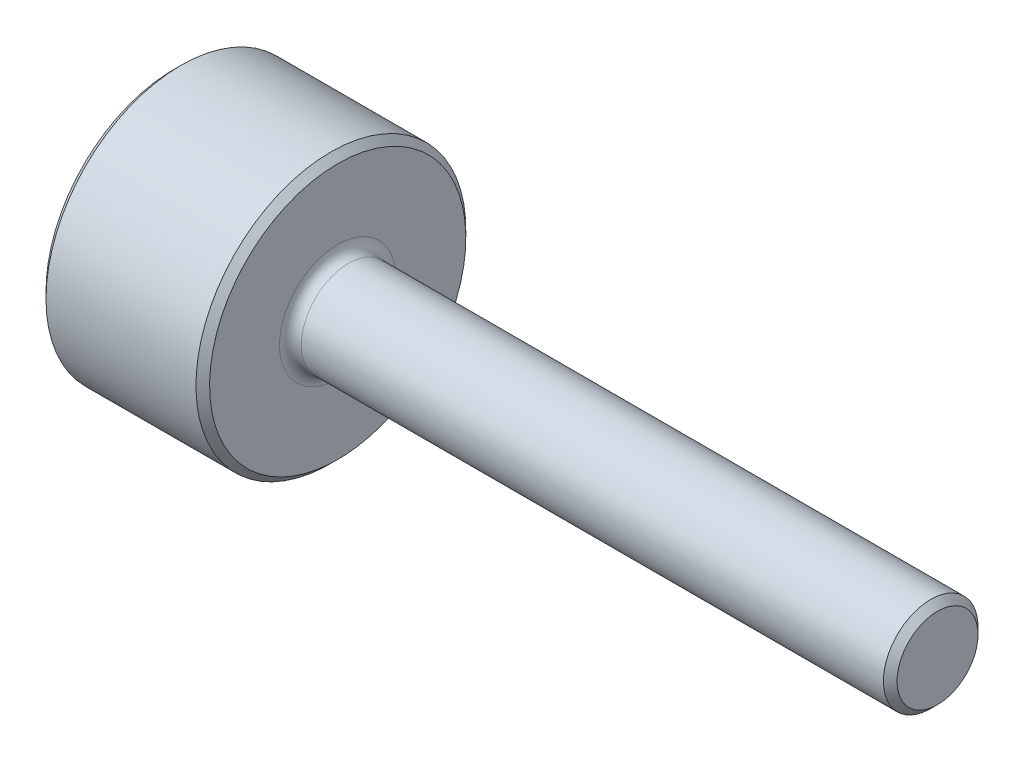
ISO-10303-21;
HEADER;
FILE_DESCRIPTION(('STEP AP214'),'2;1');
FILE_NAME('part.step','',(''),(''),'','','');
FILE_SCHEMA(('AUTOMOTIVE_DESIGN { 1 0 10303 214 1 1 1 1 }'));
ENDSEC;
DATA;
#1=APPLICATION_CONTEXT('core data for automotive mechanical design processes');
#2=APPLICATION_PROTOCOL_DEFINITION('international standard','automotive_design',2000,#1);
#3=PRODUCT_CONTEXT('',#1,'mechanical');
#4=PRODUCT('Part','Part','',(#3));
#5=PRODUCT_RELATED_PRODUCT_CATEGORY('part','',(#4));
#6=PRODUCT_DEFINITION_FORMATION('','',#4);
#7=PRODUCT_DEFINITION_CONTEXT('part definition',#1,'design');
#8=PRODUCT_DEFINITION('design','',#6,#7);
#9=PRODUCT_DEFINITION_SHAPE('','',#8);
#10=(LENGTH_UNIT() NAMED_UNIT(*) SI_UNIT(.MILLI.,.METRE.));
#11=(NAMED_UNIT(*) PLANE_ANGLE_UNIT() SI_UNIT($,.RADIAN.));
#12=(NAMED_UNIT(*) SI_UNIT($,.STERADIAN.) SOLID_ANGLE_UNIT());
#13=UNCERTAINTY_MEASURE_WITH_UNIT(LENGTH_MEASURE(1.E-05),#10,'distance_accuracy_value','');
#14=(GEOMETRIC_REPRESENTATION_CONTEXT(3) GLOBAL_UNCERTAINTY_ASSIGNED_CONTEXT((#13)) GLOBAL_UNIT_ASSIGNED_CONTEXT((#10,
#11,#12)) REPRESENTATION_CONTEXT('',''));
#15=CARTESIAN_POINT('',(0.,0.,0.));
#16=DIRECTION('',(0.,0.,1.));
#17=DIRECTION('',(1.,0.,0.));
#18=AXIS2_PLACEMENT_3D('',#15,#16,#17);
#19=CARTESIAN_POINT('',(-28.,4.94999999999999,0.));
#20=DIRECTION('',(-1.,0.,0.));
#21=DIRECTION('',(0.,-1.,0.));
#22=AXIS2_PLACEMENT_3D('',#19,#20,#21);
#23=PLANE('',#22);
#24=CARTESIAN_POINT('',(-28.,0.,0.));
#25=DIRECTION('',(-1.,0.,0.));
#26=DIRECTION('',(0.,-1.,0.));
#27=AXIS2_PLACEMENT_3D('',#24,#25,#26);
#28=CIRCLE('',#27,4.70000000000001);
#29=CARTESIAN_POINT('',(-28.,-4.70000000000001,0.));
#30=VERTEX_POINT('',#29);
#31=EDGE_CURVE('E52',#30,#30,#28,.T.);
#32=ORIENTED_EDGE('',*,*,#31,.T.);
#33=EDGE_LOOP('',(#32));
#34=FACE_BOUND('',#33,.T.);
#35=ADVANCED_FACE('F41',(#34),#23,.T.);
#36=CARTESIAN_POINT('',(0.,0.,0.));
#37=DIRECTION('',(1.,0.,0.));
#38=DIRECTION('',(0.,1.,0.));
#39=AXIS2_PLACEMENT_3D('',#36,#37,#38);
#40=CYLINDRICAL_SURFACE('',#39,4.95);
#41=CARTESIAN_POINT('',(-22.25,0.,0.));
#42=DIRECTION('',(1.,0.,0.));
#43=DIRECTION('',(0.,1.,0.));
#44=AXIS2_PLACEMENT_3D('',#41,#42,#43);
#45=CIRCLE('',#44,4.95);
#46=CARTESIAN_POINT('',(-22.25,4.94999999999999,0.));
#47=VERTEX_POINT('',#46);
#48=EDGE_CURVE('E56',#47,#47,#45,.F.);
#49=ORIENTED_EDGE('',*,*,#48,.T.);
#50=EDGE_LOOP('',(#49));
#51=FACE_BOUND('',#50,.T.);
#52=CARTESIAN_POINT('',(-27.75,0.,0.));
#53=DIRECTION('',(-1.,0.,0.));
#54=DIRECTION('',(0.,-1.,0.));
#55=AXIS2_PLACEMENT_3D('',#52,#53,#54);
#56=CIRCLE('',#55,4.95);
#57=CARTESIAN_POINT('',(-27.75,-4.95,0.));
#58=VERTEX_POINT('',#57);
#59=EDGE_CURVE('E61',#58,#58,#56,.F.);
#60=ORIENTED_EDGE('',*,*,#59,.T.);
#61=EDGE_LOOP('',(#60));
#62=FACE_BOUND('',#61,.T.);
#63=ADVANCED_FACE('F93',(#51,#62),#40,.T.);
#64=CARTESIAN_POINT('',(-22.,1.735,0.));
#65=DIRECTION('',(1.,0.,0.));
#66=DIRECTION('',(0.,1.,0.));
#67=AXIS2_PLACEMENT_3D('',#64,#65,#66);
#68=PLANE('',#67);
#69=CARTESIAN_POINT('',(-22.,0.,0.));
#70=DIRECTION('',(1.,0.,0.));
#71=DIRECTION('',(0.,1.,0.));
#72=AXIS2_PLACEMENT_3D('',#69,#70,#71);
#73=CIRCLE('',#72,2.135);
#74=CARTESIAN_POINT('',(-22.,2.135,0.));
#75=VERTEX_POINT('',#74);
#76=EDGE_CURVE('E10',#75,#75,#73,.F.);
#77=ORIENTED_EDGE('',*,*,#76,.T.);
#78=EDGE_LOOP('',(#77));
#79=FACE_BOUND('',#78,.T.);
#80=CARTESIAN_POINT('',(-22.,0.,0.));
#81=DIRECTION('',(1.,0.,0.));
#82=DIRECTION('',(0.,1.,0.));
#83=AXIS2_PLACEMENT_3D('',#80,#81,#82);
#84=CIRCLE('',#83,4.7);
#85=CARTESIAN_POINT('',(-22.,4.7,0.));
#86=VERTEX_POINT('',#85);
#87=EDGE_CURVE('E64',#86,#86,#84,.T.);
#88=ORIENTED_EDGE('',*,*,#87,.T.);
#89=EDGE_LOOP('',(#88));
#90=FACE_BOUND('',#89,.T.);
#91=ADVANCED_FACE('F98',(#79,#90),#68,.T.);
#92=CARTESIAN_POINT('',(0.,0.,0.));
#93=DIRECTION('',(1.,0.,0.));
#94=DIRECTION('',(0.,1.,0.));
#95=AXIS2_PLACEMENT_3D('',#92,#93,#94);
#96=CYLINDRICAL_SURFACE('',#95,1.735);
#97=CARTESIAN_POINT('',(-21.6,0.,0.));
#98=DIRECTION('',(1.,0.,0.));
#99=DIRECTION('',(0.,1.,0.));
#100=AXIS2_PLACEMENT_3D('',#97,#98,#99);
#101=CIRCLE('',#100,1.735);
#102=CARTESIAN_POINT('',(-21.6,1.735,0.));
#103=VERTEX_POINT('',#102);
#104=EDGE_CURVE('E48',#103,#103,#101,.T.);
#105=ORIENTED_EDGE('',*,*,#104,.T.);
#106=EDGE_LOOP('',(#105));
#107=FACE_BOUND('',#106,.T.);
#108=CARTESIAN_POINT('',(-0.25,0.,0.));
#109=DIRECTION('',(1.,0.,0.));
#110=DIRECTION('',(0.,1.,0.));
#111=AXIS2_PLACEMENT_3D('',#108,#109,#110);
#112=CIRCLE('',#111,1.735);
#113=CARTESIAN_POINT('',(-0.25,1.735,0.));
#114=VERTEX_POINT('',#113);
#115=EDGE_CURVE('E67',#114,#114,#112,.F.);
#116=ORIENTED_EDGE('',*,*,#115,.T.);
#117=EDGE_LOOP('',(#116));
#118=FACE_BOUND('',#117,.T.);
#119=ADVANCED_FACE('F88',(#107,#118),#96,.T.);
#120=CARTESIAN_POINT('',(0.,0.,0.));
#121=DIRECTION('',(1.,0.,0.));
#122=DIRECTION('',(0.,1.,0.));
#123=AXIS2_PLACEMENT_3D('',#120,#121,#122);
#124=PLANE('',#123);
#125=CARTESIAN_POINT('',(0.,0.,0.));
#126=DIRECTION('',(1.,0.,0.));
#127=DIRECTION('',(0.,1.,0.));
#128=AXIS2_PLACEMENT_3D('',#125,#126,#127);
#129=CIRCLE('',#128,1.485);
#130=CARTESIAN_POINT('',(0.,1.485,0.));
#131=VERTEX_POINT('',#130);
#132=EDGE_CURVE('E70',#131,#131,#129,.T.);
#133=ORIENTED_EDGE('',*,*,#132,.T.);
#134=EDGE_LOOP('',(#133));
#135=FACE_BOUND('',#134,.T.);
#136=ADVANCED_FACE('F74',(#135),#124,.T.);
#137=CARTESIAN_POINT('',(0.,0.,0.));
#138=DIRECTION('',(-1.,0.,0.));
#139=DIRECTION('',(0.,-1.,0.));
#140=AXIS2_PLACEMENT_3D('',#137,#138,#139);
#141=CONICAL_SURFACE('',#140,1.485,0.785398163397446);
#142=ORIENTED_EDGE('',*,*,#115,.F.);
#143=EDGE_LOOP('',(#142));
#144=FACE_BOUND('',#143,.T.);
#145=ORIENTED_EDGE('',*,*,#132,.F.);
#146=EDGE_LOOP('',(#145));
#147=FACE_BOUND('',#146,.T.);
#148=ADVANCED_FACE('F76',(#144,#147),#141,.T.);
#149=CARTESIAN_POINT('',(-22.,0.,0.));
#150=DIRECTION('',(-1.,0.,0.));
#151=DIRECTION('',(0.,-1.,0.));
#152=AXIS2_PLACEMENT_3D('',#149,#150,#151);
#153=CONICAL_SURFACE('',#152,4.7,0.785398163397452);
#154=ORIENTED_EDGE('',*,*,#48,.F.);
#155=EDGE_LOOP('',(#154));
#156=FACE_BOUND('',#155,.T.);
#157=ORIENTED_EDGE('',*,*,#87,.F.);
#158=EDGE_LOOP('',(#157));
#159=FACE_BOUND('',#158,.T.);
#160=ADVANCED_FACE('F78',(#156,#159),#153,.T.);
#161=CARTESIAN_POINT('',(-27.75,0.,0.));
#162=DIRECTION('',(1.,0.,0.));
#163=DIRECTION('',(0.,1.,0.));
#164=AXIS2_PLACEMENT_3D('',#161,#162,#163);
#165=CONICAL_SURFACE('',#164,4.95,0.785398163397438);
#166=ORIENTED_EDGE('',*,*,#31,.F.);
#167=EDGE_LOOP('',(#166));
#168=FACE_BOUND('',#167,.T.);
#169=ORIENTED_EDGE('',*,*,#59,.F.);
#170=EDGE_LOOP('',(#169));
#171=FACE_BOUND('',#170,.T.);
#172=ADVANCED_FACE('F85',(#168,#171),#165,.T.);
#173=CARTESIAN_POINT('',(-21.6,0.,0.));
#174=DIRECTION('',(1.,0.,0.));
#175=DIRECTION('',(0.,1.,0.));
#176=AXIS2_PLACEMENT_3D('',#173,#174,#175);
#177=TOROIDAL_SURFACE('',#176,2.135,0.4);
#178=ORIENTED_EDGE('',*,*,#76,.F.);
#179=EDGE_LOOP('',(#178));
#180=FACE_BOUND('',#179,.T.);
#181=ORIENTED_EDGE('',*,*,#104,.F.);
#182=EDGE_LOOP('',(#181));
#183=FACE_BOUND('',#182,.T.);
#184=ADVANCED_FACE('F43',(#180,#183),#177,.F.);
#185=CLOSED_SHELL('',(#35,#63,#91,#119,#136,#148,#160,#172,#184));
#186=MANIFOLD_SOLID_BREP('B2',#185);
#187=ADVANCED_BREP_SHAPE_REPRESENTATION('',(#18,#186),#14);
#188=SHAPE_DEFINITION_REPRESENTATION(#9,#187);
ENDSEC;
END-ISO-10303-21;
